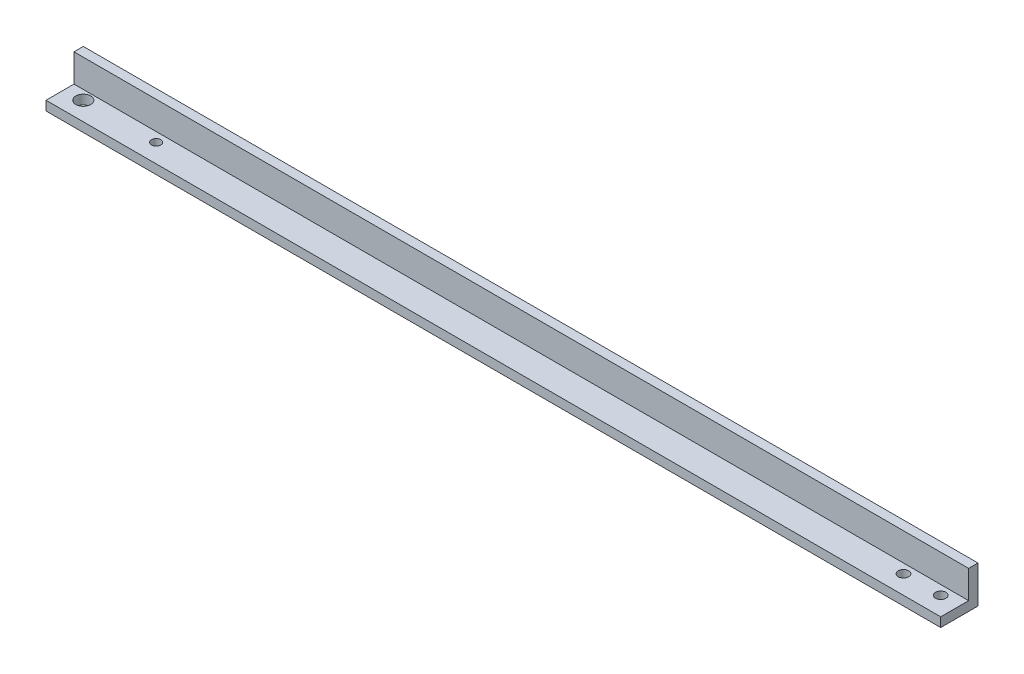
ISO-10303-21;
HEADER;
FILE_DESCRIPTION(('STEP AP214'),'2;1');
FILE_NAME('part.step','',(''),(''),'','','');
FILE_SCHEMA(('AUTOMOTIVE_DESIGN { 1 0 10303 214 1 1 1 1 }'));
ENDSEC;
DATA;
#1=APPLICATION_CONTEXT('core data for automotive mechanical design processes');
#2=APPLICATION_PROTOCOL_DEFINITION('international standard','automotive_design',2000,#1);
#3=PRODUCT_CONTEXT('',#1,'mechanical');
#4=PRODUCT('Part','Part','',(#3));
#5=PRODUCT_RELATED_PRODUCT_CATEGORY('part','',(#4));
#6=PRODUCT_DEFINITION_FORMATION('','',#4);
#7=PRODUCT_DEFINITION_CONTEXT('part definition',#1,'design');
#8=PRODUCT_DEFINITION('design','',#6,#7);
#9=PRODUCT_DEFINITION_SHAPE('','',#8);
#10=(LENGTH_UNIT() NAMED_UNIT(*) SI_UNIT(.MILLI.,.METRE.));
#11=(NAMED_UNIT(*) PLANE_ANGLE_UNIT() SI_UNIT($,.RADIAN.));
#12=(NAMED_UNIT(*) SI_UNIT($,.STERADIAN.) SOLID_ANGLE_UNIT());
#13=UNCERTAINTY_MEASURE_WITH_UNIT(LENGTH_MEASURE(1.E-05),#10,'distance_accuracy_value','');
#14=(GEOMETRIC_REPRESENTATION_CONTEXT(3) GLOBAL_UNCERTAINTY_ASSIGNED_CONTEXT((#13)) GLOBAL_UNIT_ASSIGNED_CONTEXT((#10,
#11,#12)) REPRESENTATION_CONTEXT('',''));
#15=CARTESIAN_POINT('',(0.,0.,0.));
#16=DIRECTION('',(0.,0.,1.));
#17=DIRECTION('',(1.,0.,0.));
#18=AXIS2_PLACEMENT_3D('',#15,#16,#17);
#19=CARTESIAN_POINT('',(609.6,19.05,0.));
#20=DIRECTION('',(0.,-1.,0.));
#21=DIRECTION('',(0.,0.,-1.));
#22=AXIS2_PLACEMENT_3D('',#19,#20,#21);
#23=PLANE('',#22);
#24=DIRECTION('',(0.,0.,1.));
#25=VECTOR('',#24,1.);
#26=CARTESIAN_POINT('',(0.,19.05,0.));
#27=LINE('',#26,#25);
#28=CARTESIAN_POINT('',(0.,19.05,-6.35));
#29=VERTEX_POINT('',#28);
#30=CARTESIAN_POINT('',(0.,19.05,0.));
#31=VERTEX_POINT('',#30);
#32=EDGE_CURVE('E123',#29,#31,#27,.T.);
#33=ORIENTED_EDGE('',*,*,#32,.T.);
#34=DIRECTION('',(-1.,0.,0.));
#35=VECTOR('',#34,1.);
#36=CARTESIAN_POINT('',(609.6,19.05,0.));
#37=LINE('',#36,#35);
#38=CARTESIAN_POINT('',(609.6,19.05,0.));
#39=VERTEX_POINT('',#38);
#40=EDGE_CURVE('E11',#39,#31,#37,.T.);
#41=ORIENTED_EDGE('',*,*,#40,.F.);
#42=DIRECTION('',(0.,0.,1.));
#43=VECTOR('',#42,1.);
#44=CARTESIAN_POINT('',(609.6,19.05,0.));
#45=LINE('',#44,#43);
#46=CARTESIAN_POINT('',(609.6,19.05,-6.35));
#47=VERTEX_POINT('',#46);
#48=EDGE_CURVE('E138',#47,#39,#45,.T.);
#49=ORIENTED_EDGE('',*,*,#48,.F.);
#50=DIRECTION('',(-1.,0.,0.));
#51=VECTOR('',#50,1.);
#52=CARTESIAN_POINT('',(609.6,19.05,-6.35));
#53=LINE('',#52,#51);
#54=EDGE_CURVE('E122',#47,#29,#53,.T.);
#55=ORIENTED_EDGE('',*,*,#54,.T.);
#56=EDGE_LOOP('',(#33,#41,#49,#55));
#57=FACE_BOUND('',#56,.T.);
#58=ADVANCED_FACE('F41',(#57),#23,.F.);
#59=CARTESIAN_POINT('',(609.6,0.,0.));
#60=DIRECTION('',(0.,0.,-1.));
#61=DIRECTION('',(-1.,0.,0.));
#62=AXIS2_PLACEMENT_3D('',#59,#60,#61);
#63=PLANE('',#62);
#64=DIRECTION('',(0.,-1.,0.));
#65=VECTOR('',#64,1.);
#66=CARTESIAN_POINT('',(0.,0.,0.));
#67=LINE('',#66,#65);
#68=CARTESIAN_POINT('',(0.,0.,0.));
#69=VERTEX_POINT('',#68);
#70=EDGE_CURVE('E129',#31,#69,#67,.T.);
#71=ORIENTED_EDGE('',*,*,#70,.T.);
#72=DIRECTION('',(-1.,0.,0.));
#73=VECTOR('',#72,1.);
#74=CARTESIAN_POINT('',(609.6,0.,0.));
#75=LINE('',#74,#73);
#76=CARTESIAN_POINT('',(609.6,0.,0.));
#77=VERTEX_POINT('',#76);
#78=EDGE_CURVE('E47',#77,#69,#75,.T.);
#79=ORIENTED_EDGE('',*,*,#78,.F.);
#80=DIRECTION('',(0.,-1.,0.));
#81=VECTOR('',#80,1.);
#82=CARTESIAN_POINT('',(609.6,0.,0.));
#83=LINE('',#82,#81);
#84=EDGE_CURVE('E92',#39,#77,#83,.T.);
#85=ORIENTED_EDGE('',*,*,#84,.F.);
#86=ORIENTED_EDGE('',*,*,#40,.T.);
#87=EDGE_LOOP('',(#71,#79,#85,#86));
#88=FACE_BOUND('',#87,.T.);
#89=ADVANCED_FACE('F162',(#88),#63,.F.);
#90=CARTESIAN_POINT('',(609.6,0.,19.05));
#91=DIRECTION('',(0.,-1.,0.));
#92=DIRECTION('',(0.,0.,-1.));
#93=AXIS2_PLACEMENT_3D('',#90,#91,#92);
#94=PLANE('',#93);
#95=CARTESIAN_POINT('',(12.7,0.,6.35));
#96=DIRECTION('',(0.,-1.,0.));
#97=DIRECTION('',(0.,0.,-1.));
#98=AXIS2_PLACEMENT_3D('',#95,#96,#97);
#99=CIRCLE('',#98,5.08);
#100=CARTESIAN_POINT('',(12.7,0.,1.27));
#101=VERTEX_POINT('',#100);
#102=EDGE_CURVE('E126',#101,#101,#99,.T.);
#103=ORIENTED_EDGE('',*,*,#102,.T.);
#104=EDGE_LOOP('',(#103));
#105=FACE_BOUND('',#104,.T.);
#106=CARTESIAN_POINT('',(571.5,0.,6.35));
#107=DIRECTION('',(0.,-1.,0.));
#108=DIRECTION('',(0.,0.,-1.));
#109=AXIS2_PLACEMENT_3D('',#106,#107,#108);
#110=CIRCLE('',#109,3.55599999999996);
#111=CARTESIAN_POINT('',(571.5,0.,2.79400000000004));
#112=VERTEX_POINT('',#111);
#113=EDGE_CURVE('E252',#112,#112,#110,.T.);
#114=ORIENTED_EDGE('',*,*,#113,.T.);
#115=EDGE_LOOP('',(#114));
#116=FACE_BOUND('',#115,.T.);
#117=CARTESIAN_POINT('',(596.9,0.,6.35));
#118=DIRECTION('',(0.,-1.,0.));
#119=DIRECTION('',(0.,0.,-1.));
#120=AXIS2_PLACEMENT_3D('',#117,#118,#119);
#121=CIRCLE('',#120,3.55599999999996);
#122=CARTESIAN_POINT('',(596.9,0.,2.79400000000004));
#123=VERTEX_POINT('',#122);
#124=EDGE_CURVE('E251',#123,#123,#121,.T.);
#125=ORIENTED_EDGE('',*,*,#124,.T.);
#126=EDGE_LOOP('',(#125));
#127=FACE_BOUND('',#126,.T.);
#128=CARTESIAN_POINT('',(62.357,0.,6.35));
#129=DIRECTION('',(0.,-1.,0.));
#130=DIRECTION('',(0.,0.,-1.));
#131=AXIS2_PLACEMENT_3D('',#128,#129,#130);
#132=CIRCLE('',#131,3.17500000000001);
#133=CARTESIAN_POINT('',(62.357,0.,3.17499999999999));
#134=VERTEX_POINT('',#133);
#135=EDGE_CURVE('E261',#134,#134,#132,.T.);
#136=ORIENTED_EDGE('',*,*,#135,.T.);
#137=EDGE_LOOP('',(#136));
#138=FACE_BOUND('',#137,.T.);
#139=DIRECTION('',(0.,0.,1.));
#140=VECTOR('',#139,1.);
#141=CARTESIAN_POINT('',(0.,0.,19.05));
#142=LINE('',#141,#140);
#143=CARTESIAN_POINT('',(0.,0.,19.05));
#144=VERTEX_POINT('',#143);
#145=EDGE_CURVE('E131',#69,#144,#142,.T.);
#146=ORIENTED_EDGE('',*,*,#145,.T.);
#147=DIRECTION('',(-1.,0.,0.));
#148=VECTOR('',#147,1.);
#149=CARTESIAN_POINT('',(609.6,0.,19.05));
#150=LINE('',#149,#148);
#151=CARTESIAN_POINT('',(609.6,0.,19.05));
#152=VERTEX_POINT('',#151);
#153=EDGE_CURVE('E116',#152,#144,#150,.T.);
#154=ORIENTED_EDGE('',*,*,#153,.F.);
#155=DIRECTION('',(0.,0.,1.));
#156=VECTOR('',#155,1.);
#157=CARTESIAN_POINT('',(609.6,0.,19.05));
#158=LINE('',#157,#156);
#159=EDGE_CURVE('E110',#77,#152,#158,.T.);
#160=ORIENTED_EDGE('',*,*,#159,.F.);
#161=ORIENTED_EDGE('',*,*,#78,.T.);
#162=EDGE_LOOP('',(#146,#154,#160,#161));
#163=FACE_BOUND('',#162,.T.);
#164=ADVANCED_FACE('F145',(#105,#116,#127,#138,#163),#94,.F.);
#165=CARTESIAN_POINT('',(609.6,-6.35,19.05));
#166=DIRECTION('',(0.,0.,-1.));
#167=DIRECTION('',(-1.,0.,0.));
#168=AXIS2_PLACEMENT_3D('',#165,#166,#167);
#169=PLANE('',#168);
#170=DIRECTION('',(0.,-1.,0.));
#171=VECTOR('',#170,1.);
#172=CARTESIAN_POINT('',(0.,-6.35,19.05));
#173=LINE('',#172,#171);
#174=CARTESIAN_POINT('',(0.,-6.35,19.05));
#175=VERTEX_POINT('',#174);
#176=EDGE_CURVE('E114',#144,#175,#173,.T.);
#177=ORIENTED_EDGE('',*,*,#176,.T.);
#178=DIRECTION('',(-1.,0.,0.));
#179=VECTOR('',#178,1.);
#180=CARTESIAN_POINT('',(609.6,-6.35,19.05));
#181=LINE('',#180,#179);
#182=CARTESIAN_POINT('',(609.6,-6.35,19.05));
#183=VERTEX_POINT('',#182);
#184=EDGE_CURVE('E115',#183,#175,#181,.T.);
#185=ORIENTED_EDGE('',*,*,#184,.F.);
#186=DIRECTION('',(0.,-1.,0.));
#187=VECTOR('',#186,1.);
#188=CARTESIAN_POINT('',(609.6,-6.35,19.05));
#189=LINE('',#188,#187);
#190=EDGE_CURVE('E103',#152,#183,#189,.T.);
#191=ORIENTED_EDGE('',*,*,#190,.F.);
#192=ORIENTED_EDGE('',*,*,#153,.T.);
#193=EDGE_LOOP('',(#177,#185,#191,#192));
#194=FACE_BOUND('',#193,.T.);
#195=ADVANCED_FACE('F113',(#194),#169,.F.);
#196=CARTESIAN_POINT('',(609.6,-6.35,-6.35));
#197=DIRECTION('',(0.,1.,0.));
#198=DIRECTION('',(0.,0.,1.));
#199=AXIS2_PLACEMENT_3D('',#196,#197,#198);
#200=PLANE('',#199);
#201=CARTESIAN_POINT('',(12.7,-6.35,6.35));
#202=DIRECTION('',(0.,-1.,0.));
#203=DIRECTION('',(0.,0.,-1.));
#204=AXIS2_PLACEMENT_3D('',#201,#202,#203);
#205=CIRCLE('',#204,5.08);
#206=CARTESIAN_POINT('',(12.7,-6.35000000000008,1.27));
#207=VERTEX_POINT('',#206);
#208=EDGE_CURVE('E247',#207,#207,#205,.T.);
#209=ORIENTED_EDGE('',*,*,#208,.F.);
#210=EDGE_LOOP('',(#209));
#211=FACE_BOUND('',#210,.T.);
#212=CARTESIAN_POINT('',(571.5,-6.35,6.35));
#213=DIRECTION('',(0.,-1.,0.));
#214=DIRECTION('',(0.,0.,-1.));
#215=AXIS2_PLACEMENT_3D('',#212,#213,#214);
#216=CIRCLE('',#215,3.55599999999996);
#217=CARTESIAN_POINT('',(571.5,-6.35000000000008,2.79400000000004));
#218=VERTEX_POINT('',#217);
#219=EDGE_CURVE('E266',#218,#218,#216,.T.);
#220=ORIENTED_EDGE('',*,*,#219,.F.);
#221=EDGE_LOOP('',(#220));
#222=FACE_BOUND('',#221,.T.);
#223=CARTESIAN_POINT('',(596.9,-6.35,6.35));
#224=DIRECTION('',(0.,-1.,0.));
#225=DIRECTION('',(0.,0.,-1.));
#226=AXIS2_PLACEMENT_3D('',#223,#224,#225);
#227=CIRCLE('',#226,3.55599999999996);
#228=CARTESIAN_POINT('',(596.9,-6.35000000000008,2.79400000000004));
#229=VERTEX_POINT('',#228);
#230=EDGE_CURVE('E263',#229,#229,#227,.T.);
#231=ORIENTED_EDGE('',*,*,#230,.F.);
#232=EDGE_LOOP('',(#231));
#233=FACE_BOUND('',#232,.T.);
#234=CARTESIAN_POINT('',(62.357,-6.35,6.35));
#235=DIRECTION('',(0.,-1.,0.));
#236=DIRECTION('',(0.,0.,-1.));
#237=AXIS2_PLACEMENT_3D('',#234,#235,#236);
#238=CIRCLE('',#237,3.17500000000001);
#239=CARTESIAN_POINT('',(62.357,-6.35000000000008,3.17499999999999));
#240=VERTEX_POINT('',#239);
#241=EDGE_CURVE('E270',#240,#240,#238,.T.);
#242=ORIENTED_EDGE('',*,*,#241,.F.);
#243=EDGE_LOOP('',(#242));
#244=FACE_BOUND('',#243,.T.);
#245=DIRECTION('',(0.,0.,-1.));
#246=VECTOR('',#245,1.);
#247=CARTESIAN_POINT('',(0.,-6.35,-6.35));
#248=LINE('',#247,#246);
#249=CARTESIAN_POINT('',(0.,-6.35,-6.35));
#250=VERTEX_POINT('',#249);
#251=EDGE_CURVE('E78',#175,#250,#248,.T.);
#252=ORIENTED_EDGE('',*,*,#251,.T.);
#253=DIRECTION('',(-1.,0.,0.));
#254=VECTOR('',#253,1.);
#255=CARTESIAN_POINT('',(609.6,-6.35,-6.35));
#256=LINE('',#255,#254);
#257=CARTESIAN_POINT('',(609.6,-6.35,-6.35));
#258=VERTEX_POINT('',#257);
#259=EDGE_CURVE('E120',#258,#250,#256,.T.);
#260=ORIENTED_EDGE('',*,*,#259,.F.);
#261=DIRECTION('',(0.,0.,-1.));
#262=VECTOR('',#261,1.);
#263=CARTESIAN_POINT('',(609.6,-6.35,-6.35));
#264=LINE('',#263,#262);
#265=EDGE_CURVE('E102',#183,#258,#264,.T.);
#266=ORIENTED_EDGE('',*,*,#265,.F.);
#267=ORIENTED_EDGE('',*,*,#184,.T.);
#268=EDGE_LOOP('',(#252,#260,#266,#267));
#269=FACE_BOUND('',#268,.T.);
#270=ADVANCED_FACE('F118',(#211,#222,#233,#244,#269),#200,.F.);
#271=CARTESIAN_POINT('',(609.6,19.05,-6.35));
#272=DIRECTION('',(0.,0.,1.));
#273=DIRECTION('',(0.,-1.,0.));
#274=AXIS2_PLACEMENT_3D('',#271,#272,#273);
#275=PLANE('',#274);
#276=DIRECTION('',(0.,1.,0.));
#277=VECTOR('',#276,1.);
#278=CARTESIAN_POINT('',(0.,19.05,-6.35));
#279=LINE('',#278,#277);
#280=EDGE_CURVE('E86',#250,#29,#279,.T.);
#281=ORIENTED_EDGE('',*,*,#280,.T.);
#282=ORIENTED_EDGE('',*,*,#54,.F.);
#283=DIRECTION('',(0.,1.,0.));
#284=VECTOR('',#283,1.);
#285=CARTESIAN_POINT('',(609.6,19.05,-6.35));
#286=LINE('',#285,#284);
#287=EDGE_CURVE('E60',#258,#47,#286,.T.);
#288=ORIENTED_EDGE('',*,*,#287,.F.);
#289=ORIENTED_EDGE('',*,*,#259,.T.);
#290=EDGE_LOOP('',(#281,#282,#288,#289));
#291=FACE_BOUND('',#290,.T.);
#292=ADVANCED_FACE('F146',(#291),#275,.F.);
#293=CARTESIAN_POINT('',(609.6,0.,0.));
#294=DIRECTION('',(-1.,0.,0.));
#295=DIRECTION('',(0.,0.,1.));
#296=AXIS2_PLACEMENT_3D('',#293,#294,#295);
#297=PLANE('',#296);
#298=ORIENTED_EDGE('',*,*,#48,.T.);
#299=ORIENTED_EDGE('',*,*,#84,.T.);
#300=ORIENTED_EDGE('',*,*,#159,.T.);
#301=ORIENTED_EDGE('',*,*,#190,.T.);
#302=ORIENTED_EDGE('',*,*,#265,.T.);
#303=ORIENTED_EDGE('',*,*,#287,.T.);
#304=EDGE_LOOP('',(#298,#299,#300,#301,#302,#303));
#305=FACE_BOUND('',#304,.T.);
#306=ADVANCED_FACE('F101',(#305),#297,.F.);
#307=CARTESIAN_POINT('',(0.,0.,0.));
#308=DIRECTION('',(-1.,0.,0.));
#309=DIRECTION('',(0.,0.,1.));
#310=AXIS2_PLACEMENT_3D('',#307,#308,#309);
#311=PLANE('',#310);
#312=ORIENTED_EDGE('',*,*,#32,.F.);
#313=ORIENTED_EDGE('',*,*,#280,.F.);
#314=ORIENTED_EDGE('',*,*,#251,.F.);
#315=ORIENTED_EDGE('',*,*,#176,.F.);
#316=ORIENTED_EDGE('',*,*,#145,.F.);
#317=ORIENTED_EDGE('',*,*,#70,.F.);
#318=EDGE_LOOP('',(#312,#313,#314,#315,#316,#317));
#319=FACE_BOUND('',#318,.T.);
#320=ADVANCED_FACE('F143',(#319),#311,.T.);
#321=CARTESIAN_POINT('',(62.357,908.05,6.35000000000012));
#322=DIRECTION('',(0.,-1.,0.));
#323=DIRECTION('',(0.,0.,-1.));
#324=AXIS2_PLACEMENT_3D('',#321,#322,#323);
#325=CYLINDRICAL_SURFACE('',#324,3.17500000000001);
#326=CARTESIAN_POINT('',(62.357,-6.35000000000008,3.17499999999999));
#327=CARTESIAN_POINT('',(62.357,-6.28385416666673,3.17499999999999));
#328=CARTESIAN_POINT('',(62.357,-6.21770833333339,3.17499999999999));
#329=CARTESIAN_POINT('',(62.357,-6.08541666666673,3.17499999999999));
#330=CARTESIAN_POINT('',(62.357,-6.01927083333342,3.17499999999999));
#331=CARTESIAN_POINT('',(62.357,-5.88697916666677,3.17499999999999));
#332=CARTESIAN_POINT('',(62.357,-5.82083333333342,3.17499999999999));
#333=CARTESIAN_POINT('',(62.357,-5.68854166666673,3.17499999999999));
#334=CARTESIAN_POINT('',(62.357,-5.62239583333339,3.17499999999999));
#335=CARTESIAN_POINT('',(62.357,-5.49010416666673,3.17499999999999));
#336=CARTESIAN_POINT('',(62.357,-5.42395833333342,3.17499999999999));
#337=CARTESIAN_POINT('',(62.357,-5.29166666666677,3.17499999999999));
#338=CARTESIAN_POINT('',(62.357,-5.22552083333342,3.17499999999999));
#339=CARTESIAN_POINT('',(62.357,-5.09322916666673,3.17499999999999));
#340=CARTESIAN_POINT('',(62.357,-5.02708333333339,3.17499999999999));
#341=CARTESIAN_POINT('',(62.357,-4.89479166666669,3.17499999999999));
#342=CARTESIAN_POINT('',(62.357,-4.82864583333335,3.17499999999999));
#343=CARTESIAN_POINT('',(62.357,-4.69635416666669,3.17499999999999));
#344=CARTESIAN_POINT('',(62.357,-4.63020833333339,3.17499999999999));
#345=CARTESIAN_POINT('',(62.357,-4.49791666666673,3.17499999999999));
#346=CARTESIAN_POINT('',(62.357,-4.43177083333339,3.17499999999999));
#347=CARTESIAN_POINT('',(62.357,-4.29947916666669,3.17499999999999));
#348=CARTESIAN_POINT('',(62.357,-4.23333333333335,3.17499999999999));
#349=CARTESIAN_POINT('',(62.357,-4.10104166666669,3.17499999999999));
#350=CARTESIAN_POINT('',(62.357,-4.03489583333339,3.17499999999999));
#351=CARTESIAN_POINT('',(62.357,-3.90260416666673,3.17499999999999));
#352=CARTESIAN_POINT('',(62.357,-3.83645833333338,3.17499999999999));
#353=CARTESIAN_POINT('',(62.357,-3.70416666666669,3.17499999999999));
#354=CARTESIAN_POINT('',(62.357,-3.63802083333335,3.17499999999999));
#355=CARTESIAN_POINT('',(62.357,-3.50572916666669,3.17499999999999));
#356=CARTESIAN_POINT('',(62.357,-3.43958333333338,3.17499999999999));
#357=CARTESIAN_POINT('',(62.357,-3.30729166666673,3.17499999999999));
#358=CARTESIAN_POINT('',(62.357,-3.24114583333338,3.17499999999999));
#359=CARTESIAN_POINT('',(62.357,-3.10885416666669,3.17499999999999));
#360=CARTESIAN_POINT('',(62.357,-3.04270833333335,3.17499999999999));
#361=CARTESIAN_POINT('',(62.357,-2.91041666666669,3.17499999999999));
#362=CARTESIAN_POINT('',(62.357,-2.84427083333338,3.17499999999999));
#363=CARTESIAN_POINT('',(62.357,-2.71197916666673,3.17499999999999));
#364=CARTESIAN_POINT('',(62.357,-2.64583333333338,3.17499999999999));
#365=CARTESIAN_POINT('',(62.357,-2.51354166666669,3.17499999999999));
#366=CARTESIAN_POINT('',(62.357,-2.44739583333335,3.17499999999999));
#367=CARTESIAN_POINT('',(62.357,-2.31510416666669,3.17499999999999));
#368=CARTESIAN_POINT('',(62.357,-2.24895833333338,3.17499999999999));
#369=CARTESIAN_POINT('',(62.357,-2.11666666666673,3.17499999999999));
#370=CARTESIAN_POINT('',(62.357,-2.05052083333338,3.17499999999999));
#371=CARTESIAN_POINT('',(62.357,-1.91822916666669,3.17499999999999));
#372=CARTESIAN_POINT('',(62.357,-1.85208333333335,3.17499999999999));
#373=CARTESIAN_POINT('',(62.357,-1.71979166666669,3.17499999999999));
#374=CARTESIAN_POINT('',(62.357,-1.65364583333338,3.17499999999999));
#375=CARTESIAN_POINT('',(62.357,-1.52135416666673,3.17499999999999));
#376=CARTESIAN_POINT('',(62.357,-1.45520833333338,3.17499999999999));
#377=CARTESIAN_POINT('',(62.357,-1.32291666666669,3.17499999999999));
#378=CARTESIAN_POINT('',(62.357,-1.25677083333335,3.17499999999999));
#379=CARTESIAN_POINT('',(62.357,-1.12447916666665,3.17499999999999));
#380=CARTESIAN_POINT('',(62.357,-1.05833333333331,3.17499999999999));
#381=CARTESIAN_POINT('',(62.357,-0.926041666666655,3.17499999999999));
#382=CARTESIAN_POINT('',(62.357,-0.859895833333346,3.17499999999999));
#383=CARTESIAN_POINT('',(62.357,-0.727604166666692,3.17499999999999));
#384=CARTESIAN_POINT('',(62.357,-0.661458333333346,3.17499999999999));
#385=CARTESIAN_POINT('',(62.357,-0.529166666666655,3.17499999999999));
#386=CARTESIAN_POINT('',(62.357,-0.463020833333309,3.17499999999999));
#387=CARTESIAN_POINT('',(62.357,-0.330729166666655,3.17499999999999));
#388=CARTESIAN_POINT('',(62.357,-0.264583333333346,3.17499999999999));
#389=CARTESIAN_POINT('',(62.357,-0.132291666666691,3.17499999999999));
#390=CARTESIAN_POINT('',(62.357,-0.0661458333333458,3.17499999999999));
#391=CARTESIAN_POINT('',(62.357,0.,3.17499999999999));
#392=B_SPLINE_CURVE_WITH_KNOTS('',3,(#326,#327,#328,#329,#330,#331,#332,#333,#334,#335,#336,
#337,#338,#339,#340,#341,#342,#343,#344,#345,#346,#347,#348,#349,#350,#351,#352,#353,#354,#355,
#356,#357,#358,#359,#360,#361,#362,#363,#364,#365,#366,#367,#368,#369,#370,#371,#372,#373,#374,
#375,#376,#377,#378,#379,#380,#381,#382,#383,#384,#385,#386,#387,#388,#389,#390,#391),
.UNSPECIFIED.,.F.,.F.,(4,2,2,2,2,2,2,2,2,2,2,2,2,2,2,2,2,2,2,2,2,2,2,2,2,2,2,2,2,2,2,2,4),(0.,
0.198437500000037,0.396874999999963,0.5953125,0.793750000000037,0.992187499999964,1.190625,
1.38906250000004,1.58750000000007,1.7859375,1.98437500000004,2.18281250000008,2.38125,
2.57968750000004,2.77812500000008,2.9765625,3.17500000000004,3.37343750000008,3.571875,
3.77031250000004,3.96875000000008,4.1671875,4.36562500000004,4.56406250000008,4.7625,
4.96093750000004,5.15937500000008,5.35781250000011,5.55625000000004,5.75468750000008,
5.95312500000011,6.15156250000004,6.35000000000008),.UNSPECIFIED.);
#393=EDGE_CURVE('BSEAM204',#240,#134,#392,.T.);
#394=ORIENTED_EDGE('',*,*,#241,.T.);
#395=ORIENTED_EDGE('',*,*,#135,.F.);
#396=ORIENTED_EDGE('',*,*,#393,.T.);
#397=ORIENTED_EDGE('',*,*,#393,.F.);
#398=EDGE_LOOP('',(#394,#396,#395,#397));
#399=FACE_BOUND('',#398,.T.);
#400=ADVANCED_FACE('F204',(#399),#325,.F.);
#401=CARTESIAN_POINT('',(596.9,908.05,6.35000000000012));
#402=DIRECTION('',(0.,-1.,0.));
#403=DIRECTION('',(0.,0.,-1.));
#404=AXIS2_PLACEMENT_3D('',#401,#402,#403);
#405=CYLINDRICAL_SURFACE('',#404,3.55599999999996);
#406=CARTESIAN_POINT('',(596.9,-6.35000000000008,2.79400000000004));
#407=CARTESIAN_POINT('',(596.9,-6.28385416666673,2.79400000000004));
#408=CARTESIAN_POINT('',(596.9,-6.21770833333339,2.79400000000004));
#409=CARTESIAN_POINT('',(596.9,-6.08541666666673,2.79400000000004));
#410=CARTESIAN_POINT('',(596.9,-6.01927083333342,2.79400000000004));
#411=CARTESIAN_POINT('',(596.9,-5.88697916666677,2.79400000000004));
#412=CARTESIAN_POINT('',(596.9,-5.82083333333342,2.79400000000004));
#413=CARTESIAN_POINT('',(596.9,-5.68854166666673,2.79400000000004));
#414=CARTESIAN_POINT('',(596.9,-5.62239583333339,2.79400000000004));
#415=CARTESIAN_POINT('',(596.9,-5.49010416666673,2.79400000000004));
#416=CARTESIAN_POINT('',(596.9,-5.42395833333342,2.79400000000004));
#417=CARTESIAN_POINT('',(596.9,-5.29166666666677,2.79400000000004));
#418=CARTESIAN_POINT('',(596.9,-5.22552083333342,2.79400000000004));
#419=CARTESIAN_POINT('',(596.9,-5.09322916666673,2.79400000000004));
#420=CARTESIAN_POINT('',(596.9,-5.02708333333339,2.79400000000004));
#421=CARTESIAN_POINT('',(596.9,-4.89479166666669,2.79400000000004));
#422=CARTESIAN_POINT('',(596.9,-4.82864583333335,2.79400000000004));
#423=CARTESIAN_POINT('',(596.9,-4.69635416666669,2.79400000000004));
#424=CARTESIAN_POINT('',(596.9,-4.63020833333339,2.79400000000004));
#425=CARTESIAN_POINT('',(596.9,-4.49791666666673,2.79400000000004));
#426=CARTESIAN_POINT('',(596.9,-4.43177083333339,2.79400000000004));
#427=CARTESIAN_POINT('',(596.9,-4.29947916666669,2.79400000000004));
#428=CARTESIAN_POINT('',(596.9,-4.23333333333335,2.79400000000004));
#429=CARTESIAN_POINT('',(596.9,-4.10104166666669,2.79400000000004));
#430=CARTESIAN_POINT('',(596.9,-4.03489583333339,2.79400000000004));
#431=CARTESIAN_POINT('',(596.9,-3.90260416666673,2.79400000000004));
#432=CARTESIAN_POINT('',(596.9,-3.83645833333338,2.79400000000004));
#433=CARTESIAN_POINT('',(596.9,-3.70416666666669,2.79400000000004));
#434=CARTESIAN_POINT('',(596.9,-3.63802083333335,2.79400000000004));
#435=CARTESIAN_POINT('',(596.9,-3.50572916666669,2.79400000000004));
#436=CARTESIAN_POINT('',(596.9,-3.43958333333338,2.79400000000004));
#437=CARTESIAN_POINT('',(596.9,-3.30729166666673,2.79400000000004));
#438=CARTESIAN_POINT('',(596.9,-3.24114583333338,2.79400000000004));
#439=CARTESIAN_POINT('',(596.9,-3.10885416666669,2.79400000000004));
#440=CARTESIAN_POINT('',(596.9,-3.04270833333335,2.79400000000004));
#441=CARTESIAN_POINT('',(596.9,-2.91041666666669,2.79400000000004));
#442=CARTESIAN_POINT('',(596.9,-2.84427083333338,2.79400000000004));
#443=CARTESIAN_POINT('',(596.9,-2.71197916666673,2.79400000000004));
#444=CARTESIAN_POINT('',(596.9,-2.64583333333338,2.79400000000004));
#445=CARTESIAN_POINT('',(596.9,-2.51354166666669,2.79400000000004));
#446=CARTESIAN_POINT('',(596.9,-2.44739583333335,2.79400000000004));
#447=CARTESIAN_POINT('',(596.9,-2.31510416666669,2.79400000000004));
#448=CARTESIAN_POINT('',(596.9,-2.24895833333338,2.79400000000004));
#449=CARTESIAN_POINT('',(596.9,-2.11666666666673,2.79400000000004));
#450=CARTESIAN_POINT('',(596.9,-2.05052083333338,2.79400000000004));
#451=CARTESIAN_POINT('',(596.9,-1.91822916666669,2.79400000000004));
#452=CARTESIAN_POINT('',(596.9,-1.85208333333335,2.79400000000004));
#453=CARTESIAN_POINT('',(596.9,-1.71979166666669,2.79400000000004));
#454=CARTESIAN_POINT('',(596.9,-1.65364583333338,2.79400000000004));
#455=CARTESIAN_POINT('',(596.9,-1.52135416666673,2.79400000000004));
#456=CARTESIAN_POINT('',(596.9,-1.45520833333338,2.79400000000004));
#457=CARTESIAN_POINT('',(596.9,-1.32291666666669,2.79400000000004));
#458=CARTESIAN_POINT('',(596.9,-1.25677083333335,2.79400000000004));
#459=CARTESIAN_POINT('',(596.9,-1.12447916666665,2.79400000000004));
#460=CARTESIAN_POINT('',(596.9,-1.05833333333331,2.79400000000004));
#461=CARTESIAN_POINT('',(596.9,-0.926041666666655,2.79400000000004));
#462=CARTESIAN_POINT('',(596.9,-0.859895833333346,2.79400000000004));
#463=CARTESIAN_POINT('',(596.9,-0.727604166666692,2.79400000000004));
#464=CARTESIAN_POINT('',(596.9,-0.661458333333346,2.79400000000004));
#465=CARTESIAN_POINT('',(596.9,-0.529166666666655,2.79400000000004));
#466=CARTESIAN_POINT('',(596.9,-0.463020833333309,2.79400000000004));
#467=CARTESIAN_POINT('',(596.9,-0.330729166666655,2.79400000000004));
#468=CARTESIAN_POINT('',(596.9,-0.264583333333346,2.79400000000004));
#469=CARTESIAN_POINT('',(596.9,-0.132291666666691,2.79400000000004));
#470=CARTESIAN_POINT('',(596.9,-0.0661458333333458,2.79400000000004));
#471=CARTESIAN_POINT('',(596.9,0.,2.79400000000004));
#472=B_SPLINE_CURVE_WITH_KNOTS('',3,(#406,#407,#408,#409,#410,#411,#412,#413,#414,#415,#416,
#417,#418,#419,#420,#421,#422,#423,#424,#425,#426,#427,#428,#429,#430,#431,#432,#433,#434,#435,
#436,#437,#438,#439,#440,#441,#442,#443,#444,#445,#446,#447,#448,#449,#450,#451,#452,#453,#454,
#455,#456,#457,#458,#459,#460,#461,#462,#463,#464,#465,#466,#467,#468,#469,#470,#471),
.UNSPECIFIED.,.F.,.F.,(4,2,2,2,2,2,2,2,2,2,2,2,2,2,2,2,2,2,2,2,2,2,2,2,2,2,2,2,2,2,2,2,4),(0.,
0.198437500000037,0.396874999999963,0.5953125,0.793750000000037,0.992187499999964,1.190625,
1.38906250000004,1.58750000000007,1.7859375,1.98437500000004,2.18281250000008,2.38125,
2.57968750000004,2.77812500000008,2.9765625,3.17500000000004,3.37343750000008,3.571875,
3.77031250000004,3.96875000000008,4.1671875,4.36562500000004,4.56406250000008,4.7625,
4.96093750000004,5.15937500000008,5.35781250000011,5.55625000000004,5.75468750000008,
5.95312500000011,6.15156250000004,6.35000000000008),.UNSPECIFIED.);
#473=EDGE_CURVE('BSEAM215',#229,#123,#472,.T.);
#474=ORIENTED_EDGE('',*,*,#230,.T.);
#475=ORIENTED_EDGE('',*,*,#124,.F.);
#476=ORIENTED_EDGE('',*,*,#473,.T.);
#477=ORIENTED_EDGE('',*,*,#473,.F.);
#478=EDGE_LOOP('',(#474,#476,#475,#477));
#479=FACE_BOUND('',#478,.T.);
#480=ADVANCED_FACE('F215',(#479),#405,.F.);
#481=CARTESIAN_POINT('',(571.5,908.05,6.35000000000012));
#482=DIRECTION('',(0.,-1.,0.));
#483=DIRECTION('',(0.,0.,-1.));
#484=AXIS2_PLACEMENT_3D('',#481,#482,#483);
#485=CYLINDRICAL_SURFACE('',#484,3.55599999999996);
#486=CARTESIAN_POINT('',(571.5,-6.35000000000008,2.79400000000004));
#487=CARTESIAN_POINT('',(571.5,-6.28385416666673,2.79400000000004));
#488=CARTESIAN_POINT('',(571.5,-6.21770833333339,2.79400000000004));
#489=CARTESIAN_POINT('',(571.5,-6.08541666666673,2.79400000000004));
#490=CARTESIAN_POINT('',(571.5,-6.01927083333342,2.79400000000004));
#491=CARTESIAN_POINT('',(571.5,-5.88697916666677,2.79400000000004));
#492=CARTESIAN_POINT('',(571.5,-5.82083333333342,2.79400000000004));
#493=CARTESIAN_POINT('',(571.5,-5.68854166666673,2.79400000000004));
#494=CARTESIAN_POINT('',(571.5,-5.62239583333339,2.79400000000004));
#495=CARTESIAN_POINT('',(571.5,-5.49010416666673,2.79400000000004));
#496=CARTESIAN_POINT('',(571.5,-5.42395833333342,2.79400000000004));
#497=CARTESIAN_POINT('',(571.5,-5.29166666666677,2.79400000000004));
#498=CARTESIAN_POINT('',(571.5,-5.22552083333342,2.79400000000004));
#499=CARTESIAN_POINT('',(571.5,-5.09322916666673,2.79400000000004));
#500=CARTESIAN_POINT('',(571.5,-5.02708333333339,2.79400000000004));
#501=CARTESIAN_POINT('',(571.5,-4.89479166666669,2.79400000000004));
#502=CARTESIAN_POINT('',(571.5,-4.82864583333335,2.79400000000004));
#503=CARTESIAN_POINT('',(571.5,-4.69635416666669,2.79400000000004));
#504=CARTESIAN_POINT('',(571.5,-4.63020833333339,2.79400000000004));
#505=CARTESIAN_POINT('',(571.5,-4.49791666666673,2.79400000000004));
#506=CARTESIAN_POINT('',(571.5,-4.43177083333339,2.79400000000004));
#507=CARTESIAN_POINT('',(571.5,-4.29947916666669,2.79400000000004));
#508=CARTESIAN_POINT('',(571.5,-4.23333333333335,2.79400000000004));
#509=CARTESIAN_POINT('',(571.5,-4.10104166666669,2.79400000000004));
#510=CARTESIAN_POINT('',(571.5,-4.03489583333339,2.79400000000004));
#511=CARTESIAN_POINT('',(571.5,-3.90260416666673,2.79400000000004));
#512=CARTESIAN_POINT('',(571.5,-3.83645833333338,2.79400000000004));
#513=CARTESIAN_POINT('',(571.5,-3.70416666666669,2.79400000000004));
#514=CARTESIAN_POINT('',(571.5,-3.63802083333335,2.79400000000004));
#515=CARTESIAN_POINT('',(571.5,-3.50572916666669,2.79400000000004));
#516=CARTESIAN_POINT('',(571.5,-3.43958333333338,2.79400000000004));
#517=CARTESIAN_POINT('',(571.5,-3.30729166666673,2.79400000000004));
#518=CARTESIAN_POINT('',(571.5,-3.24114583333338,2.79400000000004));
#519=CARTESIAN_POINT('',(571.5,-3.10885416666669,2.79400000000004));
#520=CARTESIAN_POINT('',(571.5,-3.04270833333335,2.79400000000004));
#521=CARTESIAN_POINT('',(571.5,-2.91041666666669,2.79400000000004));
#522=CARTESIAN_POINT('',(571.5,-2.84427083333338,2.79400000000004));
#523=CARTESIAN_POINT('',(571.5,-2.71197916666673,2.79400000000004));
#524=CARTESIAN_POINT('',(571.5,-2.64583333333338,2.79400000000004));
#525=CARTESIAN_POINT('',(571.5,-2.51354166666669,2.79400000000004));
#526=CARTESIAN_POINT('',(571.5,-2.44739583333335,2.79400000000004));
#527=CARTESIAN_POINT('',(571.5,-2.31510416666669,2.79400000000004));
#528=CARTESIAN_POINT('',(571.5,-2.24895833333338,2.79400000000004));
#529=CARTESIAN_POINT('',(571.5,-2.11666666666673,2.79400000000004));
#530=CARTESIAN_POINT('',(571.5,-2.05052083333338,2.79400000000004));
#531=CARTESIAN_POINT('',(571.5,-1.91822916666669,2.79400000000004));
#532=CARTESIAN_POINT('',(571.5,-1.85208333333335,2.79400000000004));
#533=CARTESIAN_POINT('',(571.5,-1.71979166666669,2.79400000000004));
#534=CARTESIAN_POINT('',(571.5,-1.65364583333338,2.79400000000004));
#535=CARTESIAN_POINT('',(571.5,-1.52135416666673,2.79400000000004));
#536=CARTESIAN_POINT('',(571.5,-1.45520833333338,2.79400000000004));
#537=CARTESIAN_POINT('',(571.5,-1.32291666666669,2.79400000000004));
#538=CARTESIAN_POINT('',(571.5,-1.25677083333335,2.79400000000004));
#539=CARTESIAN_POINT('',(571.5,-1.12447916666665,2.79400000000004));
#540=CARTESIAN_POINT('',(571.5,-1.05833333333331,2.79400000000004));
#541=CARTESIAN_POINT('',(571.5,-0.926041666666655,2.79400000000004));
#542=CARTESIAN_POINT('',(571.5,-0.859895833333346,2.79400000000004));
#543=CARTESIAN_POINT('',(571.5,-0.727604166666692,2.79400000000004));
#544=CARTESIAN_POINT('',(571.5,-0.661458333333346,2.79400000000004));
#545=CARTESIAN_POINT('',(571.5,-0.529166666666655,2.79400000000004));
#546=CARTESIAN_POINT('',(571.5,-0.463020833333309,2.79400000000004));
#547=CARTESIAN_POINT('',(571.5,-0.330729166666655,2.79400000000004));
#548=CARTESIAN_POINT('',(571.5,-0.264583333333346,2.79400000000004));
#549=CARTESIAN_POINT('',(571.5,-0.132291666666691,2.79400000000004));
#550=CARTESIAN_POINT('',(571.5,-0.0661458333333458,2.79400000000004));
#551=CARTESIAN_POINT('',(571.5,0.,2.79400000000004));
#552=B_SPLINE_CURVE_WITH_KNOTS('',3,(#486,#487,#488,#489,#490,#491,#492,#493,#494,#495,#496,
#497,#498,#499,#500,#501,#502,#503,#504,#505,#506,#507,#508,#509,#510,#511,#512,#513,#514,#515,
#516,#517,#518,#519,#520,#521,#522,#523,#524,#525,#526,#527,#528,#529,#530,#531,#532,#533,#534,
#535,#536,#537,#538,#539,#540,#541,#542,#543,#544,#545,#546,#547,#548,#549,#550,#551),
.UNSPECIFIED.,.F.,.F.,(4,2,2,2,2,2,2,2,2,2,2,2,2,2,2,2,2,2,2,2,2,2,2,2,2,2,2,2,2,2,2,2,4),(0.,
0.198437500000037,0.396874999999963,0.5953125,0.793750000000037,0.992187499999964,1.190625,
1.38906250000004,1.58750000000007,1.7859375,1.98437500000004,2.18281250000008,2.38125,
2.57968750000004,2.77812500000008,2.9765625,3.17500000000004,3.37343750000008,3.571875,
3.77031250000004,3.96875000000008,4.1671875,4.36562500000004,4.56406250000008,4.7625,
4.96093750000004,5.15937500000008,5.35781250000011,5.55625000000004,5.75468750000008,
5.95312500000011,6.15156250000004,6.35000000000008),.UNSPECIFIED.);
#553=EDGE_CURVE('BSEAM225',#218,#112,#552,.T.);
#554=ORIENTED_EDGE('',*,*,#219,.T.);
#555=ORIENTED_EDGE('',*,*,#113,.F.);
#556=ORIENTED_EDGE('',*,*,#553,.T.);
#557=ORIENTED_EDGE('',*,*,#553,.F.);
#558=EDGE_LOOP('',(#554,#556,#555,#557));
#559=FACE_BOUND('',#558,.T.);
#560=ADVANCED_FACE('F225',(#559),#485,.F.);
#561=CARTESIAN_POINT('',(12.7,908.05,6.35000000000012));
#562=DIRECTION('',(0.,-1.,0.));
#563=DIRECTION('',(0.,0.,-1.));
#564=AXIS2_PLACEMENT_3D('',#561,#562,#563);
#565=CYLINDRICAL_SURFACE('',#564,5.08);
#566=CARTESIAN_POINT('',(12.7,-6.35000000000008,1.27));
#567=CARTESIAN_POINT('',(12.7,-6.28385416666673,1.27));
#568=CARTESIAN_POINT('',(12.7,-6.21770833333339,1.27));
#569=CARTESIAN_POINT('',(12.7,-6.08541666666673,1.27));
#570=CARTESIAN_POINT('',(12.7,-6.01927083333342,1.27));
#571=CARTESIAN_POINT('',(12.7,-5.88697916666677,1.27));
#572=CARTESIAN_POINT('',(12.7,-5.82083333333342,1.27));
#573=CARTESIAN_POINT('',(12.7,-5.68854166666673,1.27));
#574=CARTESIAN_POINT('',(12.7,-5.62239583333339,1.27));
#575=CARTESIAN_POINT('',(12.7,-5.49010416666673,1.27));
#576=CARTESIAN_POINT('',(12.7,-5.42395833333342,1.27));
#577=CARTESIAN_POINT('',(12.7,-5.29166666666677,1.27));
#578=CARTESIAN_POINT('',(12.7,-5.22552083333342,1.27));
#579=CARTESIAN_POINT('',(12.7,-5.09322916666673,1.27));
#580=CARTESIAN_POINT('',(12.7,-5.02708333333339,1.27));
#581=CARTESIAN_POINT('',(12.7,-4.89479166666669,1.27));
#582=CARTESIAN_POINT('',(12.7,-4.82864583333335,1.27));
#583=CARTESIAN_POINT('',(12.7,-4.69635416666669,1.27));
#584=CARTESIAN_POINT('',(12.7,-4.63020833333339,1.27));
#585=CARTESIAN_POINT('',(12.7,-4.49791666666673,1.27));
#586=CARTESIAN_POINT('',(12.7,-4.43177083333339,1.27));
#587=CARTESIAN_POINT('',(12.7,-4.29947916666669,1.27));
#588=CARTESIAN_POINT('',(12.7,-4.23333333333335,1.27));
#589=CARTESIAN_POINT('',(12.7,-4.10104166666669,1.27));
#590=CARTESIAN_POINT('',(12.7,-4.03489583333339,1.27));
#591=CARTESIAN_POINT('',(12.7,-3.90260416666673,1.27));
#592=CARTESIAN_POINT('',(12.7,-3.83645833333338,1.27));
#593=CARTESIAN_POINT('',(12.7,-3.70416666666669,1.27));
#594=CARTESIAN_POINT('',(12.7,-3.63802083333335,1.27));
#595=CARTESIAN_POINT('',(12.7,-3.50572916666669,1.27));
#596=CARTESIAN_POINT('',(12.7,-3.43958333333338,1.27));
#597=CARTESIAN_POINT('',(12.7,-3.30729166666673,1.27));
#598=CARTESIAN_POINT('',(12.7,-3.24114583333338,1.27));
#599=CARTESIAN_POINT('',(12.7,-3.10885416666669,1.27));
#600=CARTESIAN_POINT('',(12.7,-3.04270833333335,1.27));
#601=CARTESIAN_POINT('',(12.7,-2.91041666666669,1.27));
#602=CARTESIAN_POINT('',(12.7,-2.84427083333338,1.27));
#603=CARTESIAN_POINT('',(12.7,-2.71197916666673,1.27));
#604=CARTESIAN_POINT('',(12.7,-2.64583333333338,1.27));
#605=CARTESIAN_POINT('',(12.7,-2.51354166666669,1.27));
#606=CARTESIAN_POINT('',(12.7,-2.44739583333335,1.27));
#607=CARTESIAN_POINT('',(12.7,-2.31510416666669,1.27));
#608=CARTESIAN_POINT('',(12.7,-2.24895833333338,1.27));
#609=CARTESIAN_POINT('',(12.7,-2.11666666666673,1.27));
#610=CARTESIAN_POINT('',(12.7,-2.05052083333338,1.27));
#611=CARTESIAN_POINT('',(12.7,-1.91822916666669,1.27));
#612=CARTESIAN_POINT('',(12.7,-1.85208333333335,1.27));
#613=CARTESIAN_POINT('',(12.7,-1.71979166666669,1.27));
#614=CARTESIAN_POINT('',(12.7,-1.65364583333338,1.27));
#615=CARTESIAN_POINT('',(12.7,-1.52135416666673,1.27));
#616=CARTESIAN_POINT('',(12.7,-1.45520833333338,1.27));
#617=CARTESIAN_POINT('',(12.7,-1.32291666666669,1.27));
#618=CARTESIAN_POINT('',(12.7,-1.25677083333335,1.27));
#619=CARTESIAN_POINT('',(12.7,-1.12447916666665,1.27));
#620=CARTESIAN_POINT('',(12.7,-1.05833333333331,1.27));
#621=CARTESIAN_POINT('',(12.7,-0.926041666666655,1.27));
#622=CARTESIAN_POINT('',(12.7,-0.859895833333346,1.27));
#623=CARTESIAN_POINT('',(12.7,-0.727604166666692,1.27));
#624=CARTESIAN_POINT('',(12.7,-0.661458333333346,1.27));
#625=CARTESIAN_POINT('',(12.7,-0.529166666666655,1.27));
#626=CARTESIAN_POINT('',(12.7,-0.463020833333309,1.27));
#627=CARTESIAN_POINT('',(12.7,-0.330729166666655,1.27));
#628=CARTESIAN_POINT('',(12.7,-0.264583333333346,1.27));
#629=CARTESIAN_POINT('',(12.7,-0.132291666666691,1.27));
#630=CARTESIAN_POINT('',(12.7,-0.0661458333333458,1.27));
#631=CARTESIAN_POINT('',(12.7,0.,1.27));
#632=B_SPLINE_CURVE_WITH_KNOTS('',3,(#566,#567,#568,#569,#570,#571,#572,#573,#574,#575,#576,
#577,#578,#579,#580,#581,#582,#583,#584,#585,#586,#587,#588,#589,#590,#591,#592,#593,#594,#595,
#596,#597,#598,#599,#600,#601,#602,#603,#604,#605,#606,#607,#608,#609,#610,#611,#612,#613,#614,
#615,#616,#617,#618,#619,#620,#621,#622,#623,#624,#625,#626,#627,#628,#629,#630,#631),
.UNSPECIFIED.,.F.,.F.,(4,2,2,2,2,2,2,2,2,2,2,2,2,2,2,2,2,2,2,2,2,2,2,2,2,2,2,2,2,2,2,2,4),(0.,
0.198437500000037,0.396874999999963,0.5953125,0.793750000000037,0.992187499999964,1.190625,
1.38906250000004,1.58750000000007,1.7859375,1.98437500000004,2.18281250000008,2.38125,
2.57968750000004,2.77812500000008,2.9765625,3.17500000000004,3.37343750000008,3.571875,
3.77031250000004,3.96875000000008,4.1671875,4.36562500000004,4.56406250000008,4.7625,
4.96093750000004,5.15937500000008,5.35781250000011,5.55625000000004,5.75468750000008,
5.95312500000011,6.15156250000004,6.35000000000008),.UNSPECIFIED.);
#633=EDGE_CURVE('BSEAM235',#207,#101,#632,.T.);
#634=ORIENTED_EDGE('',*,*,#208,.T.);
#635=ORIENTED_EDGE('',*,*,#102,.F.);
#636=ORIENTED_EDGE('',*,*,#633,.T.);
#637=ORIENTED_EDGE('',*,*,#633,.F.);
#638=EDGE_LOOP('',(#634,#636,#635,#637));
#639=FACE_BOUND('',#638,.T.);
#640=ADVANCED_FACE('F235',(#639),#565,.F.);
#641=CLOSED_SHELL('',(#58,#89,#164,#195,#270,#292,#306,#320,#400,#480,#560,#640));
#642=MANIFOLD_SOLID_BREP('B2',#641);
#643=ADVANCED_BREP_SHAPE_REPRESENTATION('',(#18,#642),#14);
#644=SHAPE_DEFINITION_REPRESENTATION(#9,#643);
ENDSEC;
END-ISO-10303-21;
